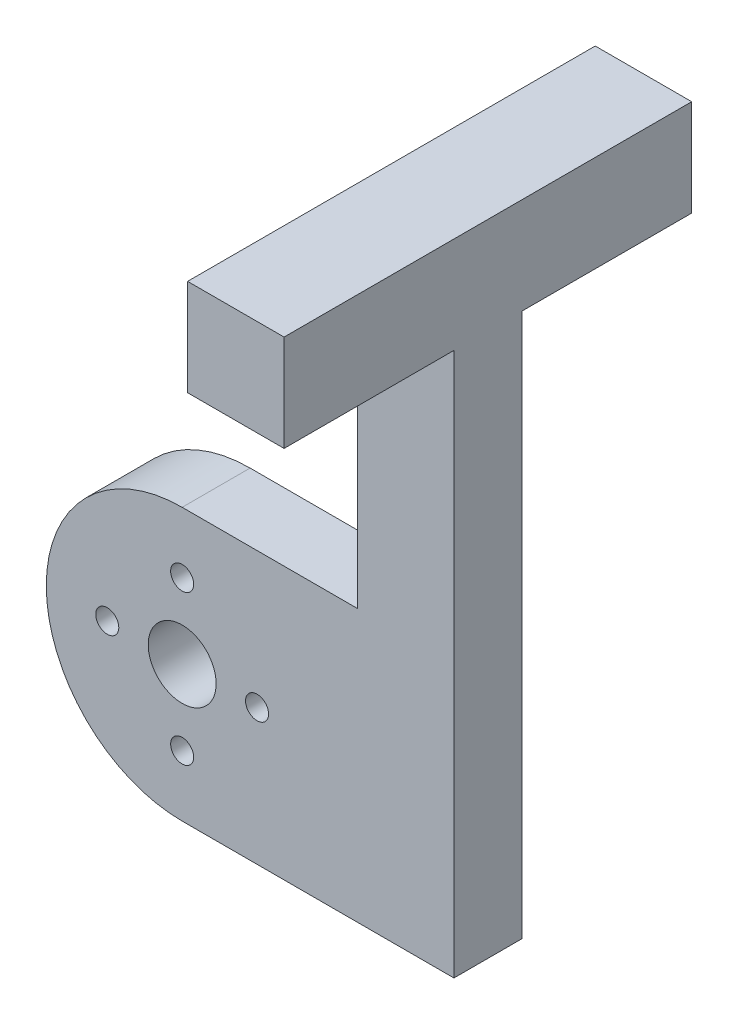
ISO-10303-21;
HEADER;
FILE_DESCRIPTION(('STEP AP214'),'2;1');
FILE_NAME('part.step','',(''),(''),'','','');
FILE_SCHEMA(('AUTOMOTIVE_DESIGN { 1 0 10303 214 1 1 1 1 }'));
ENDSEC;
DATA;
#1=APPLICATION_CONTEXT('core data for automotive mechanical design processes');
#2=APPLICATION_PROTOCOL_DEFINITION('international standard','automotive_design',2000,#1);
#3=PRODUCT_CONTEXT('',#1,'mechanical');
#4=PRODUCT('Part','Part','',(#3));
#5=PRODUCT_RELATED_PRODUCT_CATEGORY('part','',(#4));
#6=PRODUCT_DEFINITION_FORMATION('','',#4);
#7=PRODUCT_DEFINITION_CONTEXT('part definition',#1,'design');
#8=PRODUCT_DEFINITION('design','',#6,#7);
#9=PRODUCT_DEFINITION_SHAPE('','',#8);
#10=(LENGTH_UNIT() NAMED_UNIT(*) SI_UNIT(.MILLI.,.METRE.));
#11=(NAMED_UNIT(*) PLANE_ANGLE_UNIT() SI_UNIT($,.RADIAN.));
#12=(NAMED_UNIT(*) SI_UNIT($,.STERADIAN.) SOLID_ANGLE_UNIT());
#13=UNCERTAINTY_MEASURE_WITH_UNIT(LENGTH_MEASURE(1.E-05),#10,'distance_accuracy_value','');
#14=(GEOMETRIC_REPRESENTATION_CONTEXT(3) GLOBAL_UNCERTAINTY_ASSIGNED_CONTEXT((#13)) GLOBAL_UNIT_ASSIGNED_CONTEXT((#10,
#11,#12)) REPRESENTATION_CONTEXT('',''));
#15=CARTESIAN_POINT('',(0.,0.,0.));
#16=DIRECTION('',(0.,0.,1.));
#17=DIRECTION('',(1.,0.,0.));
#18=AXIS2_PLACEMENT_3D('',#15,#16,#17);
#19=CARTESIAN_POINT('',(0.,0.,3.175));
#20=DIRECTION('',(0.,0.,1.));
#21=DIRECTION('',(1.,0.,0.));
#22=AXIS2_PLACEMENT_3D('',#19,#20,#21);
#23=PLANE('',#22);
#24=CARTESIAN_POINT('',(0.,0.,3.175));
#25=DIRECTION('',(0.,0.,1.));
#26=DIRECTION('',(1.,0.,0.));
#27=AXIS2_PLACEMENT_3D('',#24,#25,#26);
#28=CIRCLE('',#27,3.175);
#29=CARTESIAN_POINT('',(3.175,0.,3.175));
#30=VERTEX_POINT('',#29);
#31=EDGE_CURVE('E444',#30,#30,#28,.T.);
#32=ORIENTED_EDGE('',*,*,#31,.F.);
#33=EDGE_LOOP('',(#32));
#34=FACE_BOUND('',#33,.T.);
#35=CARTESIAN_POINT('',(0.,6.99999997,3.175));
#36=DIRECTION('',(0.,0.,1.));
#37=DIRECTION('',(1.,0.,0.));
#38=AXIS2_PLACEMENT_3D('',#35,#36,#37);
#39=CIRCLE('',#38,1.077000005);
#40=CARTESIAN_POINT('',(1.077000005,6.99999997,3.175));
#41=VERTEX_POINT('',#40);
#42=EDGE_CURVE('E160',#41,#41,#39,.T.);
#43=ORIENTED_EDGE('',*,*,#42,.F.);
#44=EDGE_LOOP('',(#43));
#45=FACE_BOUND('',#44,.T.);
#46=CARTESIAN_POINT('',(-6.99999997,0.,3.175));
#47=DIRECTION('',(0.,0.,1.));
#48=DIRECTION('',(1.,0.,0.));
#49=AXIS2_PLACEMENT_3D('',#46,#47,#48);
#50=CIRCLE('',#49,1.077000005);
#51=CARTESIAN_POINT('',(-5.922999965,0.,3.175));
#52=VERTEX_POINT('',#51);
#53=EDGE_CURVE('E163',#52,#52,#50,.T.);
#54=ORIENTED_EDGE('',*,*,#53,.F.);
#55=EDGE_LOOP('',(#54));
#56=FACE_BOUND('',#55,.T.);
#57=CARTESIAN_POINT('',(0.,-6.99999997,3.175));
#58=DIRECTION('',(0.,0.,1.));
#59=DIRECTION('',(1.,0.,0.));
#60=AXIS2_PLACEMENT_3D('',#57,#58,#59);
#61=CIRCLE('',#60,1.077000005);
#62=CARTESIAN_POINT('',(1.077000005,-6.99999997,3.175));
#63=VERTEX_POINT('',#62);
#64=EDGE_CURVE('E166',#63,#63,#61,.T.);
#65=ORIENTED_EDGE('',*,*,#64,.F.);
#66=EDGE_LOOP('',(#65));
#67=FACE_BOUND('',#66,.T.);
#68=CARTESIAN_POINT('',(6.99999997,0.,3.175));
#69=DIRECTION('',(0.,0.,1.));
#70=DIRECTION('',(1.,0.,0.));
#71=AXIS2_PLACEMENT_3D('',#68,#69,#70);
#72=CIRCLE('',#71,1.077000005);
#73=CARTESIAN_POINT('',(8.076999975,0.,3.175));
#74=VERTEX_POINT('',#73);
#75=EDGE_CURVE('E169',#74,#74,#72,.T.);
#76=ORIENTED_EDGE('',*,*,#75,.F.);
#77=EDGE_LOOP('',(#76));
#78=FACE_BOUND('',#77,.T.);
#79=DIRECTION('',(0.,-1.,0.));
#80=VECTOR('',#79,1.);
#81=CARTESIAN_POINT('',(25.4,0.,3.175));
#82=LINE('',#81,#80);
#83=CARTESIAN_POINT('',(25.4,38.1,3.17499999999999));
#84=VERTEX_POINT('',#83);
#85=CARTESIAN_POINT('',(25.4,-12.7,3.175));
#86=VERTEX_POINT('',#85);
#87=EDGE_CURVE('E156',#84,#86,#82,.T.);
#88=ORIENTED_EDGE('',*,*,#87,.F.);
#89=DIRECTION('',(-1.,0.,0.));
#90=VECTOR('',#89,1.);
#91=CARTESIAN_POINT('',(0.,38.1,3.175));
#92=LINE('',#91,#90);
#93=CARTESIAN_POINT('',(16.383,38.1,3.17499999999999));
#94=VERTEX_POINT('',#93);
#95=EDGE_CURVE('E138',#84,#94,#92,.T.);
#96=ORIENTED_EDGE('',*,*,#95,.T.);
#97=DIRECTION('',(0.,-1.,0.));
#98=VECTOR('',#97,1.);
#99=CARTESIAN_POINT('',(16.383,0.,3.175));
#100=LINE('',#99,#98);
#101=CARTESIAN_POINT('',(16.383,12.7,3.175));
#102=VERTEX_POINT('',#101);
#103=EDGE_CURVE('E158',#94,#102,#100,.T.);
#104=ORIENTED_EDGE('',*,*,#103,.T.);
#105=DIRECTION('',(-1.,0.,0.));
#106=VECTOR('',#105,1.);
#107=CARTESIAN_POINT('',(0.,12.7,3.175));
#108=LINE('',#107,#106);
#109=CARTESIAN_POINT('',(0.,12.7,3.175));
#110=VERTEX_POINT('',#109);
#111=EDGE_CURVE('E147',#102,#110,#108,.T.);
#112=ORIENTED_EDGE('',*,*,#111,.T.);
#113=CARTESIAN_POINT('',(0.,0.,3.175));
#114=DIRECTION('',(0.,0.,1.));
#115=DIRECTION('',(1.,0.,0.));
#116=AXIS2_PLACEMENT_3D('',#113,#114,#115);
#117=CIRCLE('',#116,12.7);
#118=CARTESIAN_POINT('',(0.,-12.7,3.175));
#119=VERTEX_POINT('',#118);
#120=EDGE_CURVE('E150',#110,#119,#117,.T.);
#121=ORIENTED_EDGE('',*,*,#120,.T.);
#122=DIRECTION('',(-1.,0.,0.));
#123=VECTOR('',#122,1.);
#124=CARTESIAN_POINT('',(0.,-12.7,3.175));
#125=LINE('',#124,#123);
#126=EDGE_CURVE('E153',#86,#119,#125,.T.);
#127=ORIENTED_EDGE('',*,*,#126,.F.);
#128=EDGE_LOOP('',(#88,#96,#104,#112,#121,#127));
#129=FACE_BOUND('',#128,.T.);
#130=ADVANCED_FACE('F39',(#34,#45,#56,#67,#78,#129),#23,.T.);
#131=CARTESIAN_POINT('',(0.,0.,-3.175));
#132=DIRECTION('',(0.,0.,1.));
#133=DIRECTION('',(1.,0.,0.));
#134=AXIS2_PLACEMENT_3D('',#131,#132,#133);
#135=PLANE('',#134);
#136=CARTESIAN_POINT('',(0.,0.,-3.175));
#137=DIRECTION('',(0.,0.,1.));
#138=DIRECTION('',(1.,0.,0.));
#139=AXIS2_PLACEMENT_3D('',#136,#137,#138);
#140=CIRCLE('',#139,3.175);
#141=CARTESIAN_POINT('',(3.175,0.,-3.175));
#142=VERTEX_POINT('',#141);
#143=EDGE_CURVE('E43',#142,#142,#140,.T.);
#144=ORIENTED_EDGE('',*,*,#143,.T.);
#145=EDGE_LOOP('',(#144));
#146=FACE_BOUND('',#145,.T.);
#147=CARTESIAN_POINT('',(6.99999997,0.,-3.175));
#148=DIRECTION('',(0.,0.,1.));
#149=DIRECTION('',(1.,0.,0.));
#150=AXIS2_PLACEMENT_3D('',#147,#148,#149);
#151=CIRCLE('',#150,1.077000005);
#152=CARTESIAN_POINT('',(8.076999975,0.,-3.175));
#153=VERTEX_POINT('',#152);
#154=EDGE_CURVE('E151',#153,#153,#151,.T.);
#155=ORIENTED_EDGE('',*,*,#154,.T.);
#156=EDGE_LOOP('',(#155));
#157=FACE_BOUND('',#156,.T.);
#158=CARTESIAN_POINT('',(0.,-6.99999997,-3.175));
#159=DIRECTION('',(0.,0.,1.));
#160=DIRECTION('',(1.,0.,0.));
#161=AXIS2_PLACEMENT_3D('',#158,#159,#160);
#162=CIRCLE('',#161,1.077000005);
#163=CARTESIAN_POINT('',(1.077000005,-6.99999997,-3.175));
#164=VERTEX_POINT('',#163);
#165=EDGE_CURVE('E189',#164,#164,#162,.T.);
#166=ORIENTED_EDGE('',*,*,#165,.T.);
#167=EDGE_LOOP('',(#166));
#168=FACE_BOUND('',#167,.T.);
#169=CARTESIAN_POINT('',(-6.99999997,0.,-3.175));
#170=DIRECTION('',(0.,0.,1.));
#171=DIRECTION('',(1.,0.,0.));
#172=AXIS2_PLACEMENT_3D('',#169,#170,#171);
#173=CIRCLE('',#172,1.077000005);
#174=CARTESIAN_POINT('',(-5.922999965,0.,-3.175));
#175=VERTEX_POINT('',#174);
#176=EDGE_CURVE('E186',#175,#175,#173,.T.);
#177=ORIENTED_EDGE('',*,*,#176,.T.);
#178=EDGE_LOOP('',(#177));
#179=FACE_BOUND('',#178,.T.);
#180=CARTESIAN_POINT('',(0.,6.99999997,-3.175));
#181=DIRECTION('',(0.,0.,1.));
#182=DIRECTION('',(1.,0.,0.));
#183=AXIS2_PLACEMENT_3D('',#180,#181,#182);
#184=CIRCLE('',#183,1.077000005);
#185=CARTESIAN_POINT('',(1.077000005,6.99999997,-3.175));
#186=VERTEX_POINT('',#185);
#187=EDGE_CURVE('E183',#186,#186,#184,.T.);
#188=ORIENTED_EDGE('',*,*,#187,.T.);
#189=EDGE_LOOP('',(#188));
#190=FACE_BOUND('',#189,.T.);
#191=DIRECTION('',(-1.,0.,0.));
#192=VECTOR('',#191,1.);
#193=CARTESIAN_POINT('',(0.,38.1,-3.175));
#194=LINE('',#193,#192);
#195=CARTESIAN_POINT('',(25.4,38.1,-3.175));
#196=VERTEX_POINT('',#195);
#197=CARTESIAN_POINT('',(16.383,38.1,-3.175));
#198=VERTEX_POINT('',#197);
#199=EDGE_CURVE('E11',#196,#198,#194,.T.);
#200=ORIENTED_EDGE('',*,*,#199,.F.);
#201=DIRECTION('',(0.,-1.,0.));
#202=VECTOR('',#201,1.);
#203=CARTESIAN_POINT('',(25.4,0.,-3.175));
#204=LINE('',#203,#202);
#205=CARTESIAN_POINT('',(25.4,-12.7,-3.175));
#206=VERTEX_POINT('',#205);
#207=EDGE_CURVE('E137',#196,#206,#204,.T.);
#208=ORIENTED_EDGE('',*,*,#207,.T.);
#209=DIRECTION('',(-1.,0.,0.));
#210=VECTOR('',#209,1.);
#211=CARTESIAN_POINT('',(0.,-12.7,-3.175));
#212=LINE('',#211,#210);
#213=CARTESIAN_POINT('',(0.,-12.7,-3.175));
#214=VERTEX_POINT('',#213);
#215=EDGE_CURVE('E178',#206,#214,#212,.T.);
#216=ORIENTED_EDGE('',*,*,#215,.T.);
#217=CARTESIAN_POINT('',(0.,0.,-3.175));
#218=DIRECTION('',(0.,0.,1.));
#219=DIRECTION('',(1.,0.,0.));
#220=AXIS2_PLACEMENT_3D('',#217,#218,#219);
#221=CIRCLE('',#220,12.7);
#222=CARTESIAN_POINT('',(0.,12.7,-3.175));
#223=VERTEX_POINT('',#222);
#224=EDGE_CURVE('E175',#223,#214,#221,.T.);
#225=ORIENTED_EDGE('',*,*,#224,.F.);
#226=DIRECTION('',(-1.,0.,0.));
#227=VECTOR('',#226,1.);
#228=CARTESIAN_POINT('',(0.,12.7,-3.175));
#229=LINE('',#228,#227);
#230=CARTESIAN_POINT('',(16.383,12.7,-3.175));
#231=VERTEX_POINT('',#230);
#232=EDGE_CURVE('E142',#231,#223,#229,.T.);
#233=ORIENTED_EDGE('',*,*,#232,.F.);
#234=DIRECTION('',(0.,-1.,0.));
#235=VECTOR('',#234,1.);
#236=CARTESIAN_POINT('',(16.383,0.,-3.175));
#237=LINE('',#236,#235);
#238=EDGE_CURVE('E58',#198,#231,#237,.T.);
#239=ORIENTED_EDGE('',*,*,#238,.F.);
#240=EDGE_LOOP('',(#200,#208,#216,#225,#233,#239));
#241=FACE_BOUND('',#240,.T.);
#242=ADVANCED_FACE('F212',(#146,#157,#168,#179,#190,#241),#135,.F.);
#243=CARTESIAN_POINT('',(0.,12.7,3.175));
#244=DIRECTION('',(0.,-1.,0.));
#245=DIRECTION('',(1.,0.,0.));
#246=AXIS2_PLACEMENT_3D('',#243,#244,#245);
#247=PLANE('',#246);
#248=ORIENTED_EDGE('',*,*,#232,.T.);
#249=DIRECTION('',(0.,0.,-1.));
#250=VECTOR('',#249,1.);
#251=CARTESIAN_POINT('',(0.,12.7,3.175));
#252=LINE('',#251,#250);
#253=EDGE_CURVE('E48',#110,#223,#252,.T.);
#254=ORIENTED_EDGE('',*,*,#253,.F.);
#255=ORIENTED_EDGE('',*,*,#111,.F.);
#256=DIRECTION('',(0.,0.,-1.));
#257=VECTOR('',#256,1.);
#258=CARTESIAN_POINT('',(16.383,12.7,3.175));
#259=LINE('',#258,#257);
#260=EDGE_CURVE('E172',#102,#231,#259,.T.);
#261=ORIENTED_EDGE('',*,*,#260,.T.);
#262=EDGE_LOOP('',(#248,#254,#255,#261));
#263=FACE_BOUND('',#262,.T.);
#264=ADVANCED_FACE('F41',(#263),#247,.F.);
#265=CARTESIAN_POINT('',(0.,0.,3.175));
#266=DIRECTION('',(0.,0.,-1.));
#267=DIRECTION('',(-1.,0.,0.));
#268=AXIS2_PLACEMENT_3D('',#265,#266,#267);
#269=CYLINDRICAL_SURFACE('',#268,12.7);
#270=ORIENTED_EDGE('',*,*,#224,.T.);
#271=DIRECTION('',(0.,0.,-1.));
#272=VECTOR('',#271,1.);
#273=CARTESIAN_POINT('',(0.,-12.7,3.175));
#274=LINE('',#273,#272);
#275=EDGE_CURVE('E202',#119,#214,#274,.T.);
#276=ORIENTED_EDGE('',*,*,#275,.F.);
#277=ORIENTED_EDGE('',*,*,#120,.F.);
#278=ORIENTED_EDGE('',*,*,#253,.T.);
#279=EDGE_LOOP('',(#270,#276,#277,#278));
#280=FACE_BOUND('',#279,.T.);
#281=ADVANCED_FACE('F207',(#280),#269,.T.);
#282=CARTESIAN_POINT('',(0.,-12.7,3.175));
#283=DIRECTION('',(0.,-1.,0.));
#284=DIRECTION('',(1.,0.,0.));
#285=AXIS2_PLACEMENT_3D('',#282,#283,#284);
#286=PLANE('',#285);
#287=ORIENTED_EDGE('',*,*,#215,.F.);
#288=DIRECTION('',(0.,0.,-1.));
#289=VECTOR('',#288,1.);
#290=CARTESIAN_POINT('',(25.4,-12.7,3.175));
#291=LINE('',#290,#289);
#292=EDGE_CURVE('E200',#86,#206,#291,.T.);
#293=ORIENTED_EDGE('',*,*,#292,.F.);
#294=ORIENTED_EDGE('',*,*,#126,.T.);
#295=ORIENTED_EDGE('',*,*,#275,.T.);
#296=EDGE_LOOP('',(#287,#293,#294,#295));
#297=FACE_BOUND('',#296,.T.);
#298=ADVANCED_FACE('F216',(#297),#286,.T.);
#299=CARTESIAN_POINT('',(25.4,0.,3.175));
#300=DIRECTION('',(1.,0.,0.));
#301=DIRECTION('',(0.,1.,0.));
#302=AXIS2_PLACEMENT_3D('',#299,#300,#301);
#303=PLANE('',#302);
#304=DIRECTION('',(0.,0.,1.));
#305=VECTOR('',#304,1.);
#306=CARTESIAN_POINT('',(25.4,38.1,-19.05));
#307=LINE('',#306,#305);
#308=CARTESIAN_POINT('',(25.4,38.1,19.05));
#309=VERTEX_POINT('',#308);
#310=EDGE_CURVE('E139',#84,#309,#307,.T.);
#311=ORIENTED_EDGE('',*,*,#310,.F.);
#312=ORIENTED_EDGE('',*,*,#87,.T.);
#313=ORIENTED_EDGE('',*,*,#292,.T.);
#314=ORIENTED_EDGE('',*,*,#207,.F.);
#315=CARTESIAN_POINT('',(25.4,38.1,-19.05));
#316=VERTEX_POINT('',#315);
#317=EDGE_CURVE('E117',#316,#196,#307,.T.);
#318=ORIENTED_EDGE('',*,*,#317,.F.);
#319=DIRECTION('',(0.,-1.,0.));
#320=VECTOR('',#319,1.);
#321=CARTESIAN_POINT('',(25.4,47.117,-19.05));
#322=LINE('',#321,#320);
#323=CARTESIAN_POINT('',(25.4,47.117,-19.05));
#324=VERTEX_POINT('',#323);
#325=EDGE_CURVE('E124',#324,#316,#322,.T.);
#326=ORIENTED_EDGE('',*,*,#325,.F.);
#327=DIRECTION('',(0.,0.,-1.));
#328=VECTOR('',#327,1.);
#329=CARTESIAN_POINT('',(25.4,47.117,3.175));
#330=LINE('',#329,#328);
#331=CARTESIAN_POINT('',(25.4,47.117,19.05));
#332=VERTEX_POINT('',#331);
#333=EDGE_CURVE('E198',#332,#324,#330,.T.);
#334=ORIENTED_EDGE('',*,*,#333,.F.);
#335=DIRECTION('',(0.,-1.,0.));
#336=VECTOR('',#335,1.);
#337=CARTESIAN_POINT('',(25.4,47.117,19.05));
#338=LINE('',#337,#336);
#339=EDGE_CURVE('E229',#332,#309,#338,.T.);
#340=ORIENTED_EDGE('',*,*,#339,.T.);
#341=EDGE_LOOP('',(#311,#312,#313,#314,#318,#326,#334,#340));
#342=FACE_BOUND('',#341,.T.);
#343=ADVANCED_FACE('F135',(#342),#303,.T.);
#344=CARTESIAN_POINT('',(0.,47.117,3.175));
#345=DIRECTION('',(0.,1.,0.));
#346=DIRECTION('',(0.,0.,1.));
#347=AXIS2_PLACEMENT_3D('',#344,#345,#346);
#348=PLANE('',#347);
#349=ORIENTED_EDGE('',*,*,#333,.T.);
#350=DIRECTION('',(1.,0.,0.));
#351=VECTOR('',#350,1.);
#352=CARTESIAN_POINT('',(25.4,47.117,-19.05));
#353=LINE('',#352,#351);
#354=CARTESIAN_POINT('',(16.383,47.117,-19.05));
#355=VERTEX_POINT('',#354);
#356=EDGE_CURVE('E130',#355,#324,#353,.T.);
#357=ORIENTED_EDGE('',*,*,#356,.F.);
#358=DIRECTION('',(0.,0.,-1.));
#359=VECTOR('',#358,1.);
#360=CARTESIAN_POINT('',(16.383,47.117,3.175));
#361=LINE('',#360,#359);
#362=CARTESIAN_POINT('',(16.383,47.117,19.05));
#363=VERTEX_POINT('',#362);
#364=EDGE_CURVE('E196',#363,#355,#361,.T.);
#365=ORIENTED_EDGE('',*,*,#364,.F.);
#366=DIRECTION('',(1.,0.,0.));
#367=VECTOR('',#366,1.);
#368=CARTESIAN_POINT('',(25.4,47.117,19.05));
#369=LINE('',#368,#367);
#370=EDGE_CURVE('E132',#363,#332,#369,.T.);
#371=ORIENTED_EDGE('',*,*,#370,.T.);
#372=EDGE_LOOP('',(#349,#357,#365,#371));
#373=FACE_BOUND('',#372,.T.);
#374=ADVANCED_FACE('F239',(#373),#348,.T.);
#375=CARTESIAN_POINT('',(0.,-6.99999997,3.175));
#376=DIRECTION('',(0.,0.,-1.));
#377=DIRECTION('',(-1.,0.,0.));
#378=AXIS2_PLACEMENT_3D('',#375,#376,#377);
#379=CYLINDRICAL_SURFACE('',#378,1.077000005);
#380=ORIENTED_EDGE('',*,*,#64,.T.);
#381=EDGE_LOOP('',(#380));
#382=FACE_BOUND('',#381,.T.);
#383=ORIENTED_EDGE('',*,*,#165,.F.);
#384=EDGE_LOOP('',(#383));
#385=FACE_BOUND('',#384,.T.);
#386=ADVANCED_FACE('F269',(#382,#385),#379,.F.);
#387=CARTESIAN_POINT('',(-6.99999997,0.,3.175));
#388=DIRECTION('',(0.,0.,-1.));
#389=DIRECTION('',(-1.,0.,0.));
#390=AXIS2_PLACEMENT_3D('',#387,#388,#389);
#391=CYLINDRICAL_SURFACE('',#390,1.077000005);
#392=ORIENTED_EDGE('',*,*,#53,.T.);
#393=EDGE_LOOP('',(#392));
#394=FACE_BOUND('',#393,.T.);
#395=ORIENTED_EDGE('',*,*,#176,.F.);
#396=EDGE_LOOP('',(#395));
#397=FACE_BOUND('',#396,.T.);
#398=ADVANCED_FACE('F272',(#394,#397),#391,.F.);
#399=CARTESIAN_POINT('',(0.,6.99999997,3.175));
#400=DIRECTION('',(0.,0.,-1.));
#401=DIRECTION('',(-1.,0.,0.));
#402=AXIS2_PLACEMENT_3D('',#399,#400,#401);
#403=CYLINDRICAL_SURFACE('',#402,1.077000005);
#404=ORIENTED_EDGE('',*,*,#42,.T.);
#405=EDGE_LOOP('',(#404));
#406=FACE_BOUND('',#405,.T.);
#407=ORIENTED_EDGE('',*,*,#187,.F.);
#408=EDGE_LOOP('',(#407));
#409=FACE_BOUND('',#408,.T.);
#410=ADVANCED_FACE('F276',(#406,#409),#403,.F.);
#411=CARTESIAN_POINT('',(16.383,0.,3.175));
#412=DIRECTION('',(1.,0.,0.));
#413=DIRECTION('',(0.,1.,0.));
#414=AXIS2_PLACEMENT_3D('',#411,#412,#413);
#415=PLANE('',#414);
#416=ORIENTED_EDGE('',*,*,#364,.T.);
#417=DIRECTION('',(0.,1.,0.));
#418=VECTOR('',#417,1.);
#419=CARTESIAN_POINT('',(16.383,47.117,-19.05));
#420=LINE('',#419,#418);
#421=CARTESIAN_POINT('',(16.383,38.1,-19.05));
#422=VERTEX_POINT('',#421);
#423=EDGE_CURVE('E123',#422,#355,#420,.T.);
#424=ORIENTED_EDGE('',*,*,#423,.F.);
#425=DIRECTION('',(0.,0.,1.));
#426=VECTOR('',#425,1.);
#427=CARTESIAN_POINT('',(16.383,38.1,-19.05));
#428=LINE('',#427,#426);
#429=EDGE_CURVE('E119',#422,#198,#428,.T.);
#430=ORIENTED_EDGE('',*,*,#429,.T.);
#431=ORIENTED_EDGE('',*,*,#238,.T.);
#432=ORIENTED_EDGE('',*,*,#260,.F.);
#433=ORIENTED_EDGE('',*,*,#103,.F.);
#434=CARTESIAN_POINT('',(16.383,38.1,19.05));
#435=VERTEX_POINT('',#434);
#436=EDGE_CURVE('E223',#94,#435,#428,.T.);
#437=ORIENTED_EDGE('',*,*,#436,.T.);
#438=DIRECTION('',(0.,1.,0.));
#439=VECTOR('',#438,1.);
#440=CARTESIAN_POINT('',(16.383,47.117,19.05));
#441=LINE('',#440,#439);
#442=EDGE_CURVE('E234',#435,#363,#441,.T.);
#443=ORIENTED_EDGE('',*,*,#442,.T.);
#444=EDGE_LOOP('',(#416,#424,#430,#431,#432,#433,#437,#443));
#445=FACE_BOUND('',#444,.T.);
#446=ADVANCED_FACE('F222',(#445),#415,.F.);
#447=CARTESIAN_POINT('',(6.99999997,0.,3.175));
#448=DIRECTION('',(0.,0.,-1.));
#449=DIRECTION('',(-1.,0.,0.));
#450=AXIS2_PLACEMENT_3D('',#447,#448,#449);
#451=CYLINDRICAL_SURFACE('',#450,1.077000005);
#452=ORIENTED_EDGE('',*,*,#75,.T.);
#453=EDGE_LOOP('',(#452));
#454=FACE_BOUND('',#453,.T.);
#455=ORIENTED_EDGE('',*,*,#154,.F.);
#456=EDGE_LOOP('',(#455));
#457=FACE_BOUND('',#456,.T.);
#458=ADVANCED_FACE('F265',(#454,#457),#451,.F.);
#459=CARTESIAN_POINT('',(0.,0.,-19.05));
#460=DIRECTION('',(0.,0.,-1.));
#461=DIRECTION('',(-1.,0.,0.));
#462=AXIS2_PLACEMENT_3D('',#459,#460,#461);
#463=PLANE('',#462);
#464=ORIENTED_EDGE('',*,*,#325,.T.);
#465=DIRECTION('',(-1.,0.,0.));
#466=VECTOR('',#465,1.);
#467=CARTESIAN_POINT('',(25.4,38.1,-19.05));
#468=LINE('',#467,#466);
#469=EDGE_CURVE('E113',#316,#422,#468,.T.);
#470=ORIENTED_EDGE('',*,*,#469,.T.);
#471=ORIENTED_EDGE('',*,*,#423,.T.);
#472=ORIENTED_EDGE('',*,*,#356,.T.);
#473=EDGE_LOOP('',(#464,#470,#471,#472));
#474=FACE_BOUND('',#473,.T.);
#475=ADVANCED_FACE('F128',(#474),#463,.T.);
#476=CARTESIAN_POINT('',(25.4,38.1,-19.05));
#477=DIRECTION('',(0.,1.,0.));
#478=DIRECTION('',(0.,0.,1.));
#479=AXIS2_PLACEMENT_3D('',#476,#477,#478);
#480=PLANE('',#479);
#481=ORIENTED_EDGE('',*,*,#317,.T.);
#482=ORIENTED_EDGE('',*,*,#199,.T.);
#483=ORIENTED_EDGE('',*,*,#429,.F.);
#484=ORIENTED_EDGE('',*,*,#469,.F.);
#485=EDGE_LOOP('',(#481,#482,#483,#484));
#486=FACE_BOUND('',#485,.T.);
#487=ADVANCED_FACE('F115',(#486),#480,.F.);
#488=ORIENTED_EDGE('',*,*,#95,.F.);
#489=ORIENTED_EDGE('',*,*,#310,.T.);
#490=DIRECTION('',(-1.,0.,0.));
#491=VECTOR('',#490,1.);
#492=CARTESIAN_POINT('',(25.4,38.1,19.05));
#493=LINE('',#492,#491);
#494=EDGE_CURVE('E232',#309,#435,#493,.T.);
#495=ORIENTED_EDGE('',*,*,#494,.T.);
#496=ORIENTED_EDGE('',*,*,#436,.F.);
#497=EDGE_LOOP('',(#488,#489,#495,#496));
#498=FACE_BOUND('',#497,.T.);
#499=ADVANCED_FACE('F245',(#498),#480,.F.);
#500=CARTESIAN_POINT('',(0.,0.,19.05));
#501=DIRECTION('',(0.,0.,-1.));
#502=DIRECTION('',(-1.,0.,0.));
#503=AXIS2_PLACEMENT_3D('',#500,#501,#502);
#504=PLANE('',#503);
#505=ORIENTED_EDGE('',*,*,#339,.F.);
#506=ORIENTED_EDGE('',*,*,#370,.F.);
#507=ORIENTED_EDGE('',*,*,#442,.F.);
#508=ORIENTED_EDGE('',*,*,#494,.F.);
#509=EDGE_LOOP('',(#505,#506,#507,#508));
#510=FACE_BOUND('',#509,.T.);
#511=ADVANCED_FACE('F243',(#510),#504,.F.);
#512=CARTESIAN_POINT('',(0.,0.,-19.05));
#513=DIRECTION('',(0.,0.,1.));
#514=DIRECTION('',(1.,0.,0.));
#515=AXIS2_PLACEMENT_3D('',#512,#513,#514);
#516=CYLINDRICAL_SURFACE('',#515,3.175);
#517=ORIENTED_EDGE('',*,*,#31,.T.);
#518=EDGE_LOOP('',(#517));
#519=FACE_BOUND('',#518,.T.);
#520=ORIENTED_EDGE('',*,*,#143,.F.);
#521=EDGE_LOOP('',(#520));
#522=FACE_BOUND('',#521,.T.);
#523=ADVANCED_FACE('F252',(#519,#522),#516,.F.);
#524=CLOSED_SHELL('',(#130,#242,#264,#281,#298,#343,#374,#386,#398,#410,#446,#458,#475,#487,
#499,#511,#523));
#525=MANIFOLD_SOLID_BREP('B2',#524);
#526=ADVANCED_BREP_SHAPE_REPRESENTATION('',(#18,#525),#14);
#527=SHAPE_DEFINITION_REPRESENTATION(#9,#526);
ENDSEC;
END-ISO-10303-21;
